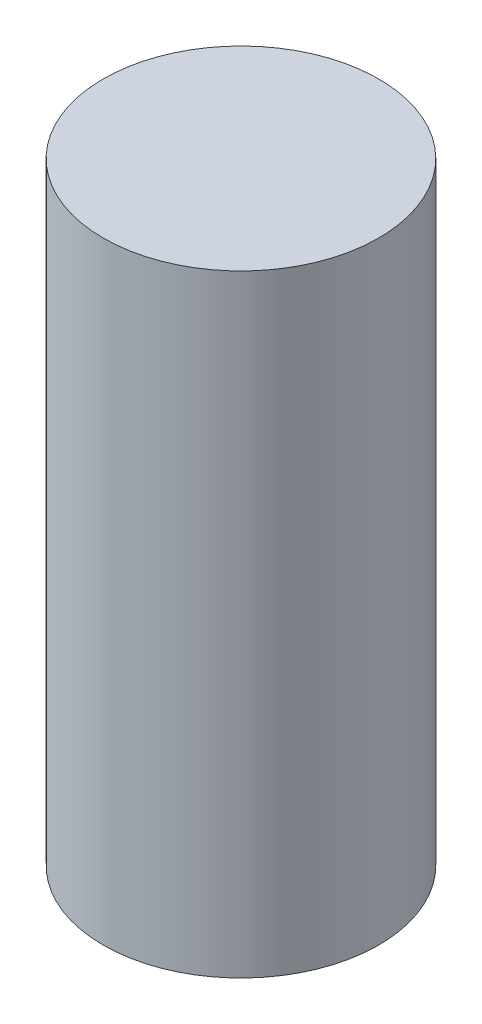
ISO-10303-21;
HEADER;
FILE_DESCRIPTION(('STEP AP214'),'2;1');
FILE_NAME('part.step','',(''),(''),'','','');
FILE_SCHEMA(('AUTOMOTIVE_DESIGN { 1 0 10303 214 1 1 1 1 }'));
ENDSEC;
DATA;
#1=APPLICATION_CONTEXT('core data for automotive mechanical design processes');
#2=APPLICATION_PROTOCOL_DEFINITION('international standard','automotive_design',2000,#1);
#3=PRODUCT_CONTEXT('',#1,'mechanical');
#4=PRODUCT('Part','Part','',(#3));
#5=PRODUCT_RELATED_PRODUCT_CATEGORY('part','',(#4));
#6=PRODUCT_DEFINITION_FORMATION('','',#4);
#7=PRODUCT_DEFINITION_CONTEXT('part definition',#1,'design');
#8=PRODUCT_DEFINITION('design','',#6,#7);
#9=PRODUCT_DEFINITION_SHAPE('','',#8);
#10=(LENGTH_UNIT() NAMED_UNIT(*) SI_UNIT(.MILLI.,.METRE.));
#11=(NAMED_UNIT(*) PLANE_ANGLE_UNIT() SI_UNIT($,.RADIAN.));
#12=(NAMED_UNIT(*) SI_UNIT($,.STERADIAN.) SOLID_ANGLE_UNIT());
#13=UNCERTAINTY_MEASURE_WITH_UNIT(LENGTH_MEASURE(1.E-05),#10,'distance_accuracy_value','');
#14=(GEOMETRIC_REPRESENTATION_CONTEXT(3) GLOBAL_UNCERTAINTY_ASSIGNED_CONTEXT((#13)) GLOBAL_UNIT_ASSIGNED_CONTEXT((#10,
#11,#12)) REPRESENTATION_CONTEXT('',''));
#15=CARTESIAN_POINT('',(0.,0.,0.));
#16=DIRECTION('',(0.,0.,1.));
#17=DIRECTION('',(1.,0.,0.));
#18=AXIS2_PLACEMENT_3D('',#15,#16,#17);
#19=CARTESIAN_POINT('',(-2.71919546590843,20.,-2.47199587809858));
#20=DIRECTION('',(0.,-1.,0.));
#21=DIRECTION('',(0.,0.,-1.));
#22=AXIS2_PLACEMENT_3D('',#19,#20,#21);
#23=CYLINDRICAL_SURFACE('',#22,4.5);
#24=CARTESIAN_POINT('',(-2.71919546590843,20.,-2.47199587809858));
#25=DIRECTION('',(0.,1.,0.));
#26=DIRECTION('',(0.,0.,1.));
#27=AXIS2_PLACEMENT_3D('',#24,#25,#26);
#28=CIRCLE('',#27,4.5);
#29=CARTESIAN_POINT('',(-2.71919546590843,20.,2.02800412190141));
#30=VERTEX_POINT('',#29);
#31=EDGE_CURVE('E10',#30,#30,#28,.T.);
#32=ORIENTED_EDGE('',*,*,#31,.F.);
#33=EDGE_LOOP('',(#32));
#34=FACE_BOUND('',#33,.T.);
#35=CARTESIAN_POINT('',(-2.71919546590843,0.,-2.47199587809858));
#36=DIRECTION('',(0.,1.,0.));
#37=DIRECTION('',(0.,0.,1.));
#38=AXIS2_PLACEMENT_3D('',#35,#36,#37);
#39=CIRCLE('',#38,4.5);
#40=CARTESIAN_POINT('',(-2.71919546590843,0.,2.02800412190141));
#41=VERTEX_POINT('',#40);
#42=EDGE_CURVE('E36',#41,#41,#39,.T.);
#43=ORIENTED_EDGE('',*,*,#42,.T.);
#44=EDGE_LOOP('',(#43));
#45=FACE_BOUND('',#44,.T.);
#46=ADVANCED_FACE('F33',(#34,#45),#23,.T.);
#47=CARTESIAN_POINT('',(-2.71919546590843,20.,-2.47199587809858));
#48=DIRECTION('',(0.,1.,0.));
#49=DIRECTION('',(0.,0.,1.));
#50=AXIS2_PLACEMENT_3D('',#47,#48,#49);
#51=PLANE('',#50);
#52=ORIENTED_EDGE('',*,*,#31,.T.);
#53=EDGE_LOOP('',(#52));
#54=FACE_BOUND('',#53,.T.);
#55=ADVANCED_FACE('F48',(#54),#51,.T.);
#56=CARTESIAN_POINT('',(-2.71919546590843,0.,-2.47199587809858));
#57=DIRECTION('',(0.,1.,0.));
#58=DIRECTION('',(0.,0.,1.));
#59=AXIS2_PLACEMENT_3D('',#56,#57,#58);
#60=PLANE('',#59);
#61=ORIENTED_EDGE('',*,*,#42,.F.);
#62=EDGE_LOOP('',(#61));
#63=FACE_BOUND('',#62,.T.);
#64=ADVANCED_FACE('F46',(#63),#60,.F.);
#65=CLOSED_SHELL('',(#46,#55,#64));
#66=MANIFOLD_SOLID_BREP('B2',#65);
#67=ADVANCED_BREP_SHAPE_REPRESENTATION('',(#18,#66),#14);
#68=SHAPE_DEFINITION_REPRESENTATION(#9,#67);
ENDSEC;
END-ISO-10303-21;
